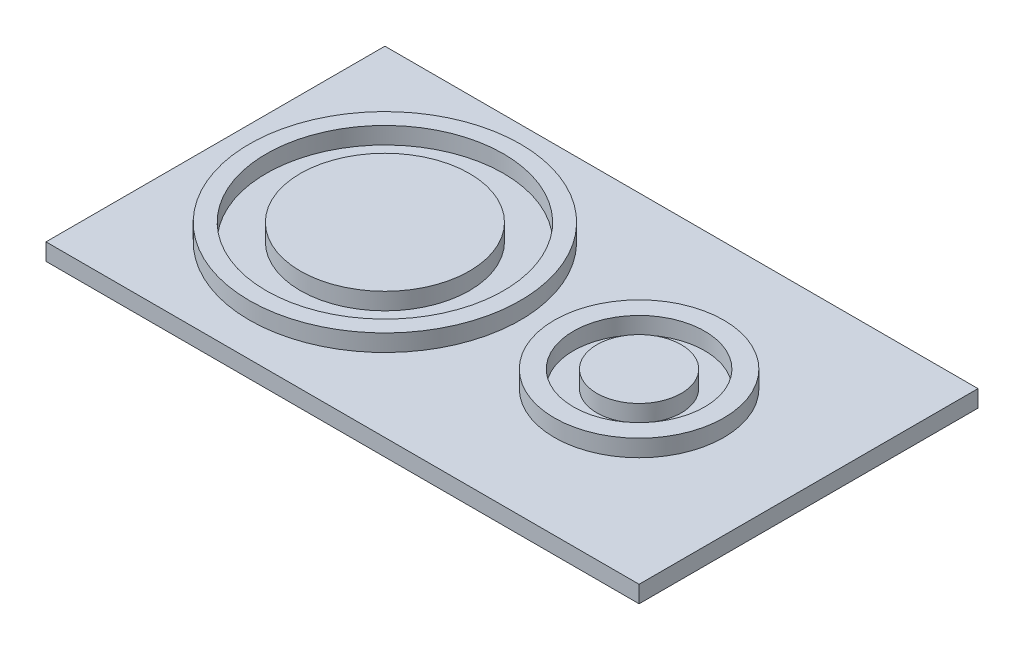
ISO-10303-21;
HEADER;
FILE_DESCRIPTION(('STEP AP214'),'2;1');
FILE_NAME('part.step','',(''),(''),'','','');
FILE_SCHEMA(('AUTOMOTIVE_DESIGN { 1 0 10303 214 1 1 1 1 }'));
ENDSEC;
DATA;
#1=APPLICATION_CONTEXT('core data for automotive mechanical design processes');
#2=APPLICATION_PROTOCOL_DEFINITION('international standard','automotive_design',2000,#1);
#3=PRODUCT_CONTEXT('',#1,'mechanical');
#4=PRODUCT('Part','Part','',(#3));
#5=PRODUCT_RELATED_PRODUCT_CATEGORY('part','',(#4));
#6=PRODUCT_DEFINITION_FORMATION('','',#4);
#7=PRODUCT_DEFINITION_CONTEXT('part definition',#1,'design');
#8=PRODUCT_DEFINITION('design','',#6,#7);
#9=PRODUCT_DEFINITION_SHAPE('','',#8);
#10=(LENGTH_UNIT() NAMED_UNIT(*) SI_UNIT(.MILLI.,.METRE.));
#11=(NAMED_UNIT(*) PLANE_ANGLE_UNIT() SI_UNIT($,.RADIAN.));
#12=(NAMED_UNIT(*) SI_UNIT($,.STERADIAN.) SOLID_ANGLE_UNIT());
#13=UNCERTAINTY_MEASURE_WITH_UNIT(LENGTH_MEASURE(1.E-05),#10,'distance_accuracy_value','');
#14=(GEOMETRIC_REPRESENTATION_CONTEXT(3) GLOBAL_UNCERTAINTY_ASSIGNED_CONTEXT((#13)) GLOBAL_UNIT_ASSIGNED_CONTEXT((#10,
#11,#12)) REPRESENTATION_CONTEXT('',''));
#15=CARTESIAN_POINT('',(0.,0.,0.));
#16=DIRECTION('',(0.,0.,1.));
#17=DIRECTION('',(1.,0.,0.));
#18=AXIS2_PLACEMENT_3D('',#15,#16,#17);
#19=CARTESIAN_POINT('',(35.,2.,20.));
#20=DIRECTION('',(-1.,0.,0.));
#21=DIRECTION('',(0.,0.,1.));
#22=AXIS2_PLACEMENT_3D('',#19,#20,#21);
#23=PLANE('',#22);
#24=DIRECTION('',(0.,0.,-1.));
#25=VECTOR('',#24,1.);
#26=CARTESIAN_POINT('',(35.,0.,20.));
#27=LINE('',#26,#25);
#28=CARTESIAN_POINT('',(35.,0.,20.));
#29=VERTEX_POINT('',#28);
#30=CARTESIAN_POINT('',(35.,0.,-20.));
#31=VERTEX_POINT('',#30);
#32=EDGE_CURVE('E125',#29,#31,#27,.T.);
#33=ORIENTED_EDGE('',*,*,#32,.T.);
#34=DIRECTION('',(0.,-1.,0.));
#35=VECTOR('',#34,1.);
#36=CARTESIAN_POINT('',(35.,2.,-20.));
#37=LINE('',#36,#35);
#38=CARTESIAN_POINT('',(35.,2.,-20.));
#39=VERTEX_POINT('',#38);
#40=EDGE_CURVE('E116',#39,#31,#37,.T.);
#41=ORIENTED_EDGE('',*,*,#40,.F.);
#42=DIRECTION('',(0.,0.,-1.));
#43=VECTOR('',#42,1.);
#44=CARTESIAN_POINT('',(35.,2.,20.));
#45=LINE('',#44,#43);
#46=CARTESIAN_POINT('',(35.,2.,20.));
#47=VERTEX_POINT('',#46);
#48=EDGE_CURVE('E110',#47,#39,#45,.T.);
#49=ORIENTED_EDGE('',*,*,#48,.F.);
#50=DIRECTION('',(0.,-1.,0.));
#51=VECTOR('',#50,1.);
#52=CARTESIAN_POINT('',(35.,2.,20.));
#53=LINE('',#52,#51);
#54=EDGE_CURVE('E121',#47,#29,#53,.T.);
#55=ORIENTED_EDGE('',*,*,#54,.T.);
#56=EDGE_LOOP('',(#33,#41,#49,#55));
#57=FACE_BOUND('',#56,.T.);
#58=ADVANCED_FACE('F58',(#57),#23,.F.);
#59=CARTESIAN_POINT('',(-35.,2.,-20.));
#60=DIRECTION('',(0.,0.,1.));
#61=DIRECTION('',(1.,0.,0.));
#62=AXIS2_PLACEMENT_3D('',#59,#60,#61);
#63=PLANE('',#62);
#64=DIRECTION('',(-1.,0.,0.));
#65=VECTOR('',#64,1.);
#66=CARTESIAN_POINT('',(-35.,0.,-20.));
#67=LINE('',#66,#65);
#68=CARTESIAN_POINT('',(-35.,0.,-20.));
#69=VERTEX_POINT('',#68);
#70=EDGE_CURVE('E115',#31,#69,#67,.T.);
#71=ORIENTED_EDGE('',*,*,#70,.T.);
#72=DIRECTION('',(0.,-1.,0.));
#73=VECTOR('',#72,1.);
#74=CARTESIAN_POINT('',(-35.,2.,-20.));
#75=LINE('',#74,#73);
#76=CARTESIAN_POINT('',(-35.,2.,-20.));
#77=VERTEX_POINT('',#76);
#78=EDGE_CURVE('E113',#77,#69,#75,.T.);
#79=ORIENTED_EDGE('',*,*,#78,.F.);
#80=DIRECTION('',(-1.,0.,0.));
#81=VECTOR('',#80,1.);
#82=CARTESIAN_POINT('',(-35.,2.,-20.));
#83=LINE('',#82,#81);
#84=EDGE_CURVE('E105',#39,#77,#83,.T.);
#85=ORIENTED_EDGE('',*,*,#84,.F.);
#86=ORIENTED_EDGE('',*,*,#40,.T.);
#87=EDGE_LOOP('',(#71,#79,#85,#86));
#88=FACE_BOUND('',#87,.T.);
#89=ADVANCED_FACE('F114',(#88),#63,.F.);
#90=CARTESIAN_POINT('',(-35.,2.,20.));
#91=DIRECTION('',(1.,0.,0.));
#92=DIRECTION('',(0.,0.,-1.));
#93=AXIS2_PLACEMENT_3D('',#90,#91,#92);
#94=PLANE('',#93);
#95=DIRECTION('',(0.,0.,1.));
#96=VECTOR('',#95,1.);
#97=CARTESIAN_POINT('',(-35.,0.,20.));
#98=LINE('',#97,#96);
#99=CARTESIAN_POINT('',(-35.,0.,20.));
#100=VERTEX_POINT('',#99);
#101=EDGE_CURVE('E91',#69,#100,#98,.T.);
#102=ORIENTED_EDGE('',*,*,#101,.T.);
#103=DIRECTION('',(0.,-1.,0.));
#104=VECTOR('',#103,1.);
#105=CARTESIAN_POINT('',(-35.,2.,20.));
#106=LINE('',#105,#104);
#107=CARTESIAN_POINT('',(-35.,2.,20.));
#108=VERTEX_POINT('',#107);
#109=EDGE_CURVE('E117',#108,#100,#106,.T.);
#110=ORIENTED_EDGE('',*,*,#109,.F.);
#111=DIRECTION('',(0.,0.,1.));
#112=VECTOR('',#111,1.);
#113=CARTESIAN_POINT('',(-35.,2.,20.));
#114=LINE('',#113,#112);
#115=EDGE_CURVE('E108',#77,#108,#114,.T.);
#116=ORIENTED_EDGE('',*,*,#115,.F.);
#117=ORIENTED_EDGE('',*,*,#78,.T.);
#118=EDGE_LOOP('',(#102,#110,#116,#117));
#119=FACE_BOUND('',#118,.T.);
#120=ADVANCED_FACE('F119',(#119),#94,.F.);
#121=CARTESIAN_POINT('',(-35.,2.,20.));
#122=DIRECTION('',(0.,0.,-1.));
#123=DIRECTION('',(-1.,0.,0.));
#124=AXIS2_PLACEMENT_3D('',#121,#122,#123);
#125=PLANE('',#124);
#126=DIRECTION('',(1.,0.,0.));
#127=VECTOR('',#126,1.);
#128=CARTESIAN_POINT('',(-35.,0.,20.));
#129=LINE('',#128,#127);
#130=EDGE_CURVE('E97',#100,#29,#129,.T.);
#131=ORIENTED_EDGE('',*,*,#130,.T.);
#132=ORIENTED_EDGE('',*,*,#54,.F.);
#133=DIRECTION('',(1.,0.,0.));
#134=VECTOR('',#133,1.);
#135=CARTESIAN_POINT('',(-35.,2.,20.));
#136=LINE('',#135,#134);
#137=EDGE_CURVE('E74',#108,#47,#136,.T.);
#138=ORIENTED_EDGE('',*,*,#137,.F.);
#139=ORIENTED_EDGE('',*,*,#109,.T.);
#140=EDGE_LOOP('',(#131,#132,#138,#139));
#141=FACE_BOUND('',#140,.T.);
#142=ADVANCED_FACE('F148',(#141),#125,.F.);
#143=CARTESIAN_POINT('',(0.,2.,0.));
#144=DIRECTION('',(0.,-1.,0.));
#145=DIRECTION('',(0.,0.,-1.));
#146=AXIS2_PLACEMENT_3D('',#143,#144,#145);
#147=PLANE('',#146);
#148=CARTESIAN_POINT('',(15.,2.,0.));
#149=DIRECTION('',(0.,-1.,0.));
#150=DIRECTION('',(0.,0.,-1.));
#151=AXIS2_PLACEMENT_3D('',#148,#149,#150);
#152=CIRCLE('',#151,9.99999999999999);
#153=CARTESIAN_POINT('',(15.,2.,-9.99999999999999));
#154=VERTEX_POINT('',#153);
#155=EDGE_CURVE('E66',#154,#154,#152,.F.);
#156=ORIENTED_EDGE('',*,*,#155,.F.);
#157=EDGE_LOOP('',(#156));
#158=FACE_BOUND('',#157,.T.);
#159=CARTESIAN_POINT('',(-15.,2.,0.));
#160=DIRECTION('',(0.,-1.,0.));
#161=DIRECTION('',(0.,0.,-1.));
#162=AXIS2_PLACEMENT_3D('',#159,#160,#161);
#163=CIRCLE('',#162,16.);
#164=CARTESIAN_POINT('',(-15.,2.,-16.));
#165=VERTEX_POINT('',#164);
#166=EDGE_CURVE('E135',#165,#165,#163,.F.);
#167=ORIENTED_EDGE('',*,*,#166,.F.);
#168=EDGE_LOOP('',(#167));
#169=FACE_BOUND('',#168,.T.);
#170=ORIENTED_EDGE('',*,*,#48,.T.);
#171=ORIENTED_EDGE('',*,*,#84,.T.);
#172=ORIENTED_EDGE('',*,*,#115,.T.);
#173=ORIENTED_EDGE('',*,*,#137,.T.);
#174=EDGE_LOOP('',(#170,#171,#172,#173));
#175=FACE_BOUND('',#174,.T.);
#176=ADVANCED_FACE('F106',(#158,#169,#175),#147,.F.);
#177=CARTESIAN_POINT('',(0.,0.,0.));
#178=DIRECTION('',(0.,-1.,0.));
#179=DIRECTION('',(0.,0.,-1.));
#180=AXIS2_PLACEMENT_3D('',#177,#178,#179);
#181=PLANE('',#180);
#182=ORIENTED_EDGE('',*,*,#32,.F.);
#183=ORIENTED_EDGE('',*,*,#130,.F.);
#184=ORIENTED_EDGE('',*,*,#101,.F.);
#185=ORIENTED_EDGE('',*,*,#70,.F.);
#186=EDGE_LOOP('',(#182,#183,#184,#185));
#187=FACE_BOUND('',#186,.T.);
#188=ADVANCED_FACE('F147',(#187),#181,.T.);
#189=CARTESIAN_POINT('',(-15.,4.,0.));
#190=DIRECTION('',(0.,-1.,0.));
#191=DIRECTION('',(0.,0.,-1.));
#192=AXIS2_PLACEMENT_3D('',#189,#190,#191);
#193=CYLINDRICAL_SURFACE('',#192,14.);
#194=CARTESIAN_POINT('',(-15.,4.,0.));
#195=DIRECTION('',(0.,1.,0.));
#196=DIRECTION('',(0.,0.,1.));
#197=AXIS2_PLACEMENT_3D('',#194,#195,#196);
#198=CIRCLE('',#197,14.);
#199=CARTESIAN_POINT('',(-15.,4.,14.));
#200=VERTEX_POINT('',#199);
#201=EDGE_CURVE('E321',#200,#200,#198,.T.);
#202=ORIENTED_EDGE('',*,*,#201,.T.);
#203=EDGE_LOOP('',(#202));
#204=FACE_BOUND('',#203,.T.);
#205=CARTESIAN_POINT('',(-15.,2.,0.));
#206=DIRECTION('',(0.,1.,0.));
#207=DIRECTION('',(0.,0.,1.));
#208=AXIS2_PLACEMENT_3D('',#205,#206,#207);
#209=CIRCLE('',#208,14.);
#210=CARTESIAN_POINT('',(-15.,2.,14.));
#211=VERTEX_POINT('',#210);
#212=EDGE_CURVE('E320',#211,#211,#209,.T.);
#213=ORIENTED_EDGE('',*,*,#212,.F.);
#214=EDGE_LOOP('',(#213));
#215=FACE_BOUND('',#214,.T.);
#216=ADVANCED_FACE('F157',(#204,#215),#193,.F.);
#217=CARTESIAN_POINT('',(-15.,4.,0.));
#218=DIRECTION('',(0.,-1.,0.));
#219=DIRECTION('',(0.,0.,-1.));
#220=AXIS2_PLACEMENT_3D('',#217,#218,#219);
#221=CYLINDRICAL_SURFACE('',#220,16.);
#222=CARTESIAN_POINT('',(-15.,4.,0.));
#223=DIRECTION('',(0.,1.,0.));
#224=DIRECTION('',(0.,0.,1.));
#225=AXIS2_PLACEMENT_3D('',#222,#223,#224);
#226=CIRCLE('',#225,16.);
#227=CARTESIAN_POINT('',(-15.,4.,16.));
#228=VERTEX_POINT('',#227);
#229=EDGE_CURVE('E128',#228,#228,#226,.T.);
#230=ORIENTED_EDGE('',*,*,#229,.F.);
#231=EDGE_LOOP('',(#230));
#232=FACE_BOUND('',#231,.T.);
#233=ORIENTED_EDGE('',*,*,#166,.T.);
#234=EDGE_LOOP('',(#233));
#235=FACE_BOUND('',#234,.T.);
#236=ADVANCED_FACE('F154',(#232,#235),#221,.T.);
#237=CARTESIAN_POINT('',(0.,4.,0.));
#238=DIRECTION('',(0.,1.,0.));
#239=DIRECTION('',(0.,0.,1.));
#240=AXIS2_PLACEMENT_3D('',#237,#238,#239);
#241=PLANE('',#240);
#242=ORIENTED_EDGE('',*,*,#201,.F.);
#243=EDGE_LOOP('',(#242));
#244=FACE_BOUND('',#243,.T.);
#245=ORIENTED_EDGE('',*,*,#229,.T.);
#246=EDGE_LOOP('',(#245));
#247=FACE_BOUND('',#246,.T.);
#248=ADVANCED_FACE('F156',(#244,#247),#241,.T.);
#249=CARTESIAN_POINT('',(-15.,2.,0.));
#250=DIRECTION('',(0.,-1.,0.));
#251=DIRECTION('',(0.,0.,-1.));
#252=AXIS2_PLACEMENT_3D('',#249,#250,#251);
#253=CIRCLE('',#252,9.98);
#254=CARTESIAN_POINT('',(-15.,2.,-9.98));
#255=VERTEX_POINT('',#254);
#256=EDGE_CURVE('E12',#255,#255,#253,.F.);
#257=ORIENTED_EDGE('',*,*,#256,.F.);
#258=EDGE_LOOP('',(#257));
#259=FACE_BOUND('',#258,.T.);
#260=ORIENTED_EDGE('',*,*,#212,.T.);
#261=EDGE_LOOP('',(#260));
#262=FACE_BOUND('',#261,.T.);
#263=ADVANCED_FACE('F151',(#259,#262),#147,.F.);
#264=CARTESIAN_POINT('',(15.,4.,0.));
#265=DIRECTION('',(0.,1.,0.));
#266=DIRECTION('',(0.,0.,1.));
#267=AXIS2_PLACEMENT_3D('',#264,#265,#266);
#268=PLANE('',#267);
#269=CARTESIAN_POINT('',(15.,4.,0.));
#270=DIRECTION('',(0.,1.,0.));
#271=DIRECTION('',(0.,0.,1.));
#272=AXIS2_PLACEMENT_3D('',#269,#270,#271);
#273=CIRCLE('',#272,9.99999999999999);
#274=CARTESIAN_POINT('',(15.,4.,9.99999999999999));
#275=VERTEX_POINT('',#274);
#276=EDGE_CURVE('E306',#275,#275,#273,.T.);
#277=ORIENTED_EDGE('',*,*,#276,.T.);
#278=EDGE_LOOP('',(#277));
#279=FACE_BOUND('',#278,.T.);
#280=CARTESIAN_POINT('',(15.,4.,0.));
#281=DIRECTION('',(0.,1.,0.));
#282=DIRECTION('',(0.,0.,1.));
#283=AXIS2_PLACEMENT_3D('',#280,#281,#282);
#284=CIRCLE('',#283,7.75);
#285=CARTESIAN_POINT('',(15.,4.,7.75));
#286=VERTEX_POINT('',#285);
#287=EDGE_CURVE('E309',#286,#286,#284,.T.);
#288=ORIENTED_EDGE('',*,*,#287,.F.);
#289=EDGE_LOOP('',(#288));
#290=FACE_BOUND('',#289,.T.);
#291=ADVANCED_FACE('F225',(#279,#290),#268,.T.);
#292=CARTESIAN_POINT('',(15.,4.,0.));
#293=DIRECTION('',(0.,-1.,0.));
#294=DIRECTION('',(0.,0.,-1.));
#295=AXIS2_PLACEMENT_3D('',#292,#293,#294);
#296=CYLINDRICAL_SURFACE('',#295,9.99999999999999);
#297=ORIENTED_EDGE('',*,*,#276,.F.);
#298=EDGE_LOOP('',(#297));
#299=FACE_BOUND('',#298,.T.);
#300=ORIENTED_EDGE('',*,*,#155,.T.);
#301=EDGE_LOOP('',(#300));
#302=FACE_BOUND('',#301,.T.);
#303=ADVANCED_FACE('F143',(#299,#302),#296,.T.);
#304=CARTESIAN_POINT('',(15.,4.,0.));
#305=DIRECTION('',(0.,-1.,0.));
#306=DIRECTION('',(0.,0.,-1.));
#307=AXIS2_PLACEMENT_3D('',#304,#305,#306);
#308=CYLINDRICAL_SURFACE('',#307,7.75);
#309=ORIENTED_EDGE('',*,*,#287,.T.);
#310=EDGE_LOOP('',(#309));
#311=FACE_BOUND('',#310,.T.);
#312=CARTESIAN_POINT('',(15.,2.,0.));
#313=DIRECTION('',(0.,1.,0.));
#314=DIRECTION('',(0.,0.,1.));
#315=AXIS2_PLACEMENT_3D('',#312,#313,#314);
#316=CIRCLE('',#315,7.75);
#317=CARTESIAN_POINT('',(15.,2.,7.75));
#318=VERTEX_POINT('',#317);
#319=EDGE_CURVE('E312',#318,#318,#316,.T.);
#320=ORIENTED_EDGE('',*,*,#319,.F.);
#321=EDGE_LOOP('',(#320));
#322=FACE_BOUND('',#321,.T.);
#323=ADVANCED_FACE('F242',(#311,#322),#308,.F.);
#324=CARTESIAN_POINT('',(15.,4.,0.));
#325=DIRECTION('',(0.,1.,0.));
#326=DIRECTION('',(0.,0.,1.));
#327=AXIS2_PLACEMENT_3D('',#324,#325,#326);
#328=PLANE('',#327);
#329=CARTESIAN_POINT('',(15.,4.,0.));
#330=DIRECTION('',(0.,1.,0.));
#331=DIRECTION('',(0.,0.,1.));
#332=AXIS2_PLACEMENT_3D('',#329,#330,#331);
#333=CIRCLE('',#332,4.98);
#334=CARTESIAN_POINT('',(15.,4.,4.98));
#335=VERTEX_POINT('',#334);
#336=EDGE_CURVE('E315',#335,#335,#333,.T.);
#337=ORIENTED_EDGE('',*,*,#336,.T.);
#338=EDGE_LOOP('',(#337));
#339=FACE_BOUND('',#338,.T.);
#340=ADVANCED_FACE('F252',(#339),#328,.T.);
#341=CARTESIAN_POINT('',(15.,4.,0.));
#342=DIRECTION('',(0.,-1.,0.));
#343=DIRECTION('',(0.,0.,-1.));
#344=AXIS2_PLACEMENT_3D('',#341,#342,#343);
#345=CYLINDRICAL_SURFACE('',#344,4.98);
#346=ORIENTED_EDGE('',*,*,#336,.F.);
#347=EDGE_LOOP('',(#346));
#348=FACE_BOUND('',#347,.T.);
#349=CARTESIAN_POINT('',(15.,2.,0.));
#350=DIRECTION('',(0.,-1.,0.));
#351=DIRECTION('',(0.,0.,-1.));
#352=AXIS2_PLACEMENT_3D('',#349,#350,#351);
#353=CIRCLE('',#352,4.98);
#354=CARTESIAN_POINT('',(15.,2.,-4.98));
#355=VERTEX_POINT('',#354);
#356=EDGE_CURVE('E138',#355,#355,#353,.F.);
#357=ORIENTED_EDGE('',*,*,#356,.T.);
#358=EDGE_LOOP('',(#357));
#359=FACE_BOUND('',#358,.T.);
#360=ADVANCED_FACE('F262',(#348,#359),#345,.T.);
#361=ORIENTED_EDGE('',*,*,#356,.F.);
#362=EDGE_LOOP('',(#361));
#363=FACE_BOUND('',#362,.T.);
#364=ORIENTED_EDGE('',*,*,#319,.T.);
#365=EDGE_LOOP('',(#364));
#366=FACE_BOUND('',#365,.T.);
#367=ADVANCED_FACE('F150',(#363,#366),#147,.F.);
#368=CARTESIAN_POINT('',(-15.,4.,0.));
#369=DIRECTION('',(0.,-1.,0.));
#370=DIRECTION('',(0.,0.,-1.));
#371=AXIS2_PLACEMENT_3D('',#368,#369,#370);
#372=CYLINDRICAL_SURFACE('',#371,9.98);
#373=CARTESIAN_POINT('',(-15.,4.,0.));
#374=DIRECTION('',(0.,1.,0.));
#375=DIRECTION('',(0.,0.,1.));
#376=AXIS2_PLACEMENT_3D('',#373,#374,#375);
#377=CIRCLE('',#376,9.98);
#378=CARTESIAN_POINT('',(-15.,4.,9.98));
#379=VERTEX_POINT('',#378);
#380=EDGE_CURVE('E305',#379,#379,#377,.T.);
#381=ORIENTED_EDGE('',*,*,#380,.F.);
#382=EDGE_LOOP('',(#381));
#383=FACE_BOUND('',#382,.T.);
#384=ORIENTED_EDGE('',*,*,#256,.T.);
#385=EDGE_LOOP('',(#384));
#386=FACE_BOUND('',#385,.T.);
#387=ADVANCED_FACE('F281',(#383,#386),#372,.T.);
#388=CARTESIAN_POINT('',(-15.,4.,0.));
#389=DIRECTION('',(0.,1.,0.));
#390=DIRECTION('',(0.,0.,1.));
#391=AXIS2_PLACEMENT_3D('',#388,#389,#390);
#392=PLANE('',#391);
#393=ORIENTED_EDGE('',*,*,#380,.T.);
#394=EDGE_LOOP('',(#393));
#395=FACE_BOUND('',#394,.T.);
#396=ADVANCED_FACE('F289',(#395),#392,.T.);
#397=CLOSED_SHELL('',(#58,#89,#120,#142,#176,#188,#216,#236,#248,#263,#291,#303,#323,#340,#360,
#367,#387,#396));
#398=MANIFOLD_SOLID_BREP('B2',#397);
#399=ADVANCED_BREP_SHAPE_REPRESENTATION('',(#18,#398),#14);
#400=SHAPE_DEFINITION_REPRESENTATION(#9,#399);
ENDSEC;
END-ISO-10303-21;
